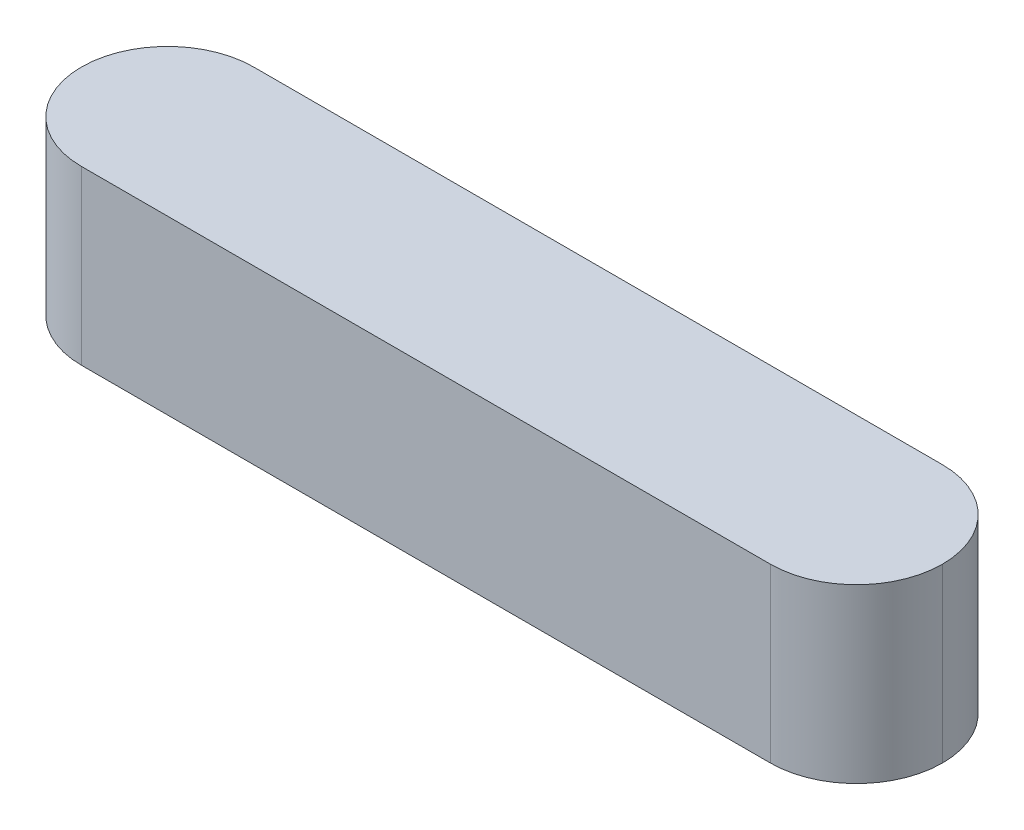
ISO-10303-21;
HEADER;
FILE_DESCRIPTION(('STEP AP214'),'2;1');
FILE_NAME('part.step','',(''),(''),'','','');
FILE_SCHEMA(('AUTOMOTIVE_DESIGN { 1 0 10303 214 1 1 1 1 }'));
ENDSEC;
DATA;
#1=APPLICATION_CONTEXT('core data for automotive mechanical design processes');
#2=APPLICATION_PROTOCOL_DEFINITION('international standard','automotive_design',2000,#1);
#3=PRODUCT_CONTEXT('',#1,'mechanical');
#4=PRODUCT('Part','Part','',(#3));
#5=PRODUCT_RELATED_PRODUCT_CATEGORY('part','',(#4));
#6=PRODUCT_DEFINITION_FORMATION('','',#4);
#7=PRODUCT_DEFINITION_CONTEXT('part definition',#1,'design');
#8=PRODUCT_DEFINITION('design','',#6,#7);
#9=PRODUCT_DEFINITION_SHAPE('','',#8);
#10=(LENGTH_UNIT() NAMED_UNIT(*) SI_UNIT(.MILLI.,.METRE.));
#11=(NAMED_UNIT(*) PLANE_ANGLE_UNIT() SI_UNIT($,.RADIAN.));
#12=(NAMED_UNIT(*) SI_UNIT($,.STERADIAN.) SOLID_ANGLE_UNIT());
#13=UNCERTAINTY_MEASURE_WITH_UNIT(LENGTH_MEASURE(1.E-05),#10,'distance_accuracy_value','');
#14=(GEOMETRIC_REPRESENTATION_CONTEXT(3) GLOBAL_UNCERTAINTY_ASSIGNED_CONTEXT((#13)) GLOBAL_UNIT_ASSIGNED_CONTEXT((#10,
#11,#12)) REPRESENTATION_CONTEXT('',''));
#15=CARTESIAN_POINT('',(0.,0.,0.));
#16=DIRECTION('',(0.,0.,1.));
#17=DIRECTION('',(1.,0.,0.));
#18=AXIS2_PLACEMENT_3D('',#15,#16,#17);
#19=CARTESIAN_POINT('',(0.,4.,0.));
#20=DIRECTION('',(0.,0.,-1.));
#21=DIRECTION('',(-1.,0.,0.));
#22=AXIS2_PLACEMENT_3D('',#19,#20,#21);
#23=PLANE('',#22);
#24=DIRECTION('',(1.,0.,0.));
#25=VECTOR('',#24,1.);
#26=CARTESIAN_POINT('',(0.,4.,0.));
#27=LINE('',#26,#25);
#28=CARTESIAN_POINT('',(2.,4.,0.));
#29=VERTEX_POINT('',#28);
#30=CARTESIAN_POINT('',(18.,4.,0.));
#31=VERTEX_POINT('',#30);
#32=EDGE_CURVE('E128',#29,#31,#27,.T.);
#33=ORIENTED_EDGE('',*,*,#32,.F.);
#34=DIRECTION('',(0.,-1.,0.));
#35=VECTOR('',#34,1.);
#36=CARTESIAN_POINT('',(2.,4.,0.));
#37=LINE('',#36,#35);
#38=CARTESIAN_POINT('',(2.,0.,0.));
#39=VERTEX_POINT('',#38);
#40=EDGE_CURVE('E11',#29,#39,#37,.T.);
#41=ORIENTED_EDGE('',*,*,#40,.T.);
#42=DIRECTION('',(1.,0.,0.));
#43=VECTOR('',#42,1.);
#44=CARTESIAN_POINT('',(0.,0.,0.));
#45=LINE('',#44,#43);
#46=CARTESIAN_POINT('',(18.,0.,0.));
#47=VERTEX_POINT('',#46);
#48=EDGE_CURVE('E91',#39,#47,#45,.T.);
#49=ORIENTED_EDGE('',*,*,#48,.T.);
#50=DIRECTION('',(0.,-1.,0.));
#51=VECTOR('',#50,1.);
#52=CARTESIAN_POINT('',(18.,4.,0.));
#53=LINE('',#52,#51);
#54=EDGE_CURVE('E39',#47,#31,#53,.F.);
#55=ORIENTED_EDGE('',*,*,#54,.T.);
#56=EDGE_LOOP('',(#33,#41,#49,#55));
#57=FACE_BOUND('',#56,.T.);
#58=ADVANCED_FACE('F32',(#57),#23,.F.);
#59=CARTESIAN_POINT('',(0.,4.,-4.));
#60=DIRECTION('',(0.,0.,1.));
#61=DIRECTION('',(1.,0.,0.));
#62=AXIS2_PLACEMENT_3D('',#59,#60,#61);
#63=PLANE('',#62);
#64=DIRECTION('',(-1.,0.,0.));
#65=VECTOR('',#64,1.);
#66=CARTESIAN_POINT('',(0.,0.,-4.));
#67=LINE('',#66,#65);
#68=CARTESIAN_POINT('',(18.,0.,-4.));
#69=VERTEX_POINT('',#68);
#70=CARTESIAN_POINT('',(2.,0.,-4.));
#71=VERTEX_POINT('',#70);
#72=EDGE_CURVE('E127',#69,#71,#67,.T.);
#73=ORIENTED_EDGE('',*,*,#72,.T.);
#74=DIRECTION('',(0.,-1.,0.));
#75=VECTOR('',#74,1.);
#76=CARTESIAN_POINT('',(2.,4.,-4.));
#77=LINE('',#76,#75);
#78=CARTESIAN_POINT('',(2.,4.,-4.));
#79=VERTEX_POINT('',#78);
#80=EDGE_CURVE('E107',#71,#79,#77,.F.);
#81=ORIENTED_EDGE('',*,*,#80,.T.);
#82=DIRECTION('',(-1.,0.,0.));
#83=VECTOR('',#82,1.);
#84=CARTESIAN_POINT('',(0.,4.,-4.));
#85=LINE('',#84,#83);
#86=CARTESIAN_POINT('',(18.,4.,-4.));
#87=VERTEX_POINT('',#86);
#88=EDGE_CURVE('E123',#87,#79,#85,.T.);
#89=ORIENTED_EDGE('',*,*,#88,.F.);
#90=DIRECTION('',(0.,-1.,0.));
#91=VECTOR('',#90,1.);
#92=CARTESIAN_POINT('',(18.,4.,-4.));
#93=LINE('',#92,#91);
#94=EDGE_CURVE('E108',#87,#69,#93,.T.);
#95=ORIENTED_EDGE('',*,*,#94,.T.);
#96=EDGE_LOOP('',(#73,#81,#89,#95));
#97=FACE_BOUND('',#96,.T.);
#98=ADVANCED_FACE('F125',(#97),#63,.F.);
#99=CARTESIAN_POINT('',(0.,4.,0.));
#100=DIRECTION('',(0.,-1.,0.));
#101=DIRECTION('',(0.,0.,-1.));
#102=AXIS2_PLACEMENT_3D('',#99,#100,#101);
#103=PLANE('',#102);
#104=ORIENTED_EDGE('',*,*,#88,.T.);
#105=CARTESIAN_POINT('',(2.,4.,-2.));
#106=DIRECTION('',(0.,-1.,0.));
#107=DIRECTION('',(0.,0.,-1.));
#108=AXIS2_PLACEMENT_3D('',#105,#106,#107);
#109=CIRCLE('',#108,2.);
#110=CARTESIAN_POINT('',(0.,4.,-2.));
#111=VERTEX_POINT('',#110);
#112=EDGE_CURVE('E119',#79,#111,#109,.F.);
#113=ORIENTED_EDGE('',*,*,#112,.T.);
#114=CARTESIAN_POINT('',(2.,4.,-2.));
#115=DIRECTION('',(0.,-1.,0.));
#116=DIRECTION('',(0.,0.,-1.));
#117=AXIS2_PLACEMENT_3D('',#114,#115,#116);
#118=CIRCLE('',#117,2.);
#119=EDGE_CURVE('E100',#111,#29,#118,.F.);
#120=ORIENTED_EDGE('',*,*,#119,.T.);
#121=ORIENTED_EDGE('',*,*,#32,.T.);
#122=CARTESIAN_POINT('',(18.,4.,-2.));
#123=DIRECTION('',(0.,-1.,0.));
#124=DIRECTION('',(0.,0.,-1.));
#125=AXIS2_PLACEMENT_3D('',#122,#123,#124);
#126=CIRCLE('',#125,2.);
#127=CARTESIAN_POINT('',(20.,4.,-2.));
#128=VERTEX_POINT('',#127);
#129=EDGE_CURVE('E46',#31,#128,#126,.F.);
#130=ORIENTED_EDGE('',*,*,#129,.T.);
#131=CARTESIAN_POINT('',(18.,4.,-2.));
#132=DIRECTION('',(0.,-1.,0.));
#133=DIRECTION('',(0.,0.,-1.));
#134=AXIS2_PLACEMENT_3D('',#131,#132,#133);
#135=CIRCLE('',#134,2.);
#136=EDGE_CURVE('E116',#128,#87,#135,.F.);
#137=ORIENTED_EDGE('',*,*,#136,.T.);
#138=EDGE_LOOP('',(#104,#113,#120,#121,#130,#137));
#139=FACE_BOUND('',#138,.T.);
#140=ADVANCED_FACE('F121',(#139),#103,.F.);
#141=CARTESIAN_POINT('',(0.,0.,0.));
#142=DIRECTION('',(0.,-1.,0.));
#143=DIRECTION('',(0.,0.,-1.));
#144=AXIS2_PLACEMENT_3D('',#141,#142,#143);
#145=PLANE('',#144);
#146=CARTESIAN_POINT('',(2.,0.,-2.));
#147=DIRECTION('',(0.,-1.,0.));
#148=DIRECTION('',(0.,0.,-1.));
#149=AXIS2_PLACEMENT_3D('',#146,#147,#148);
#150=CIRCLE('',#149,2.);
#151=CARTESIAN_POINT('',(0.,0.,-2.));
#152=VERTEX_POINT('',#151);
#153=EDGE_CURVE('E84',#39,#152,#150,.T.);
#154=ORIENTED_EDGE('',*,*,#153,.T.);
#155=CARTESIAN_POINT('',(2.,0.,-2.));
#156=DIRECTION('',(0.,-1.,0.));
#157=DIRECTION('',(0.,0.,-1.));
#158=AXIS2_PLACEMENT_3D('',#155,#156,#157);
#159=CIRCLE('',#158,2.);
#160=EDGE_CURVE('E89',#152,#71,#159,.T.);
#161=ORIENTED_EDGE('',*,*,#160,.T.);
#162=ORIENTED_EDGE('',*,*,#72,.F.);
#163=CARTESIAN_POINT('',(18.,0.,-2.));
#164=DIRECTION('',(0.,-1.,0.));
#165=DIRECTION('',(0.,0.,-1.));
#166=AXIS2_PLACEMENT_3D('',#163,#164,#165);
#167=CIRCLE('',#166,2.);
#168=CARTESIAN_POINT('',(20.,0.,-2.));
#169=VERTEX_POINT('',#168);
#170=EDGE_CURVE('E94',#69,#169,#167,.T.);
#171=ORIENTED_EDGE('',*,*,#170,.T.);
#172=CARTESIAN_POINT('',(18.,0.,-2.));
#173=DIRECTION('',(0.,-1.,0.));
#174=DIRECTION('',(0.,0.,-1.));
#175=AXIS2_PLACEMENT_3D('',#172,#173,#174);
#176=CIRCLE('',#175,2.);
#177=EDGE_CURVE('E134',#169,#47,#176,.T.);
#178=ORIENTED_EDGE('',*,*,#177,.T.);
#179=ORIENTED_EDGE('',*,*,#48,.F.);
#180=EDGE_LOOP('',(#154,#161,#162,#171,#178,#179));
#181=FACE_BOUND('',#180,.T.);
#182=ADVANCED_FACE('F86',(#181),#145,.T.);
#183=CARTESIAN_POINT('',(2.,4.,-2.));
#184=DIRECTION('',(0.,-1.,0.));
#185=DIRECTION('',(0.,0.,-1.));
#186=AXIS2_PLACEMENT_3D('',#183,#184,#185);
#187=CYLINDRICAL_SURFACE('',#186,2.);
#188=ORIENTED_EDGE('',*,*,#40,.F.);
#189=ORIENTED_EDGE('',*,*,#119,.F.);
#190=DIRECTION('',(0.,-1.,0.));
#191=VECTOR('',#190,1.);
#192=CARTESIAN_POINT('',(0.,4.,-2.));
#193=LINE('',#192,#191);
#194=EDGE_CURVE('E98',#152,#111,#193,.F.);
#195=ORIENTED_EDGE('',*,*,#194,.F.);
#196=ORIENTED_EDGE('',*,*,#153,.F.);
#197=EDGE_LOOP('',(#188,#189,#195,#196));
#198=FACE_BOUND('',#197,.T.);
#199=ADVANCED_FACE('F99',(#198),#187,.T.);
#200=CARTESIAN_POINT('',(2.,4.,-2.));
#201=DIRECTION('',(0.,-1.,0.));
#202=DIRECTION('',(0.,0.,-1.));
#203=AXIS2_PLACEMENT_3D('',#200,#201,#202);
#204=CYLINDRICAL_SURFACE('',#203,2.);
#205=ORIENTED_EDGE('',*,*,#112,.F.);
#206=ORIENTED_EDGE('',*,*,#80,.F.);
#207=ORIENTED_EDGE('',*,*,#160,.F.);
#208=ORIENTED_EDGE('',*,*,#194,.T.);
#209=EDGE_LOOP('',(#205,#206,#207,#208));
#210=FACE_BOUND('',#209,.T.);
#211=ADVANCED_FACE('F105',(#210),#204,.T.);
#212=CARTESIAN_POINT('',(18.,4.,-2.));
#213=DIRECTION('',(0.,-1.,0.));
#214=DIRECTION('',(0.,0.,-1.));
#215=AXIS2_PLACEMENT_3D('',#212,#213,#214);
#216=CYLINDRICAL_SURFACE('',#215,2.);
#217=DIRECTION('',(0.,-1.,0.));
#218=VECTOR('',#217,1.);
#219=CARTESIAN_POINT('',(20.,4.,-2.));
#220=LINE('',#219,#218);
#221=EDGE_CURVE('E102',#128,#169,#220,.T.);
#222=ORIENTED_EDGE('',*,*,#221,.F.);
#223=ORIENTED_EDGE('',*,*,#129,.F.);
#224=ORIENTED_EDGE('',*,*,#54,.F.);
#225=ORIENTED_EDGE('',*,*,#177,.F.);
#226=EDGE_LOOP('',(#222,#223,#224,#225));
#227=FACE_BOUND('',#226,.T.);
#228=ADVANCED_FACE('F139',(#227),#216,.T.);
#229=CARTESIAN_POINT('',(18.,4.,-2.));
#230=DIRECTION('',(0.,-1.,0.));
#231=DIRECTION('',(0.,0.,-1.));
#232=AXIS2_PLACEMENT_3D('',#229,#230,#231);
#233=CYLINDRICAL_SURFACE('',#232,2.);
#234=ORIENTED_EDGE('',*,*,#136,.F.);
#235=ORIENTED_EDGE('',*,*,#221,.T.);
#236=ORIENTED_EDGE('',*,*,#170,.F.);
#237=ORIENTED_EDGE('',*,*,#94,.F.);
#238=EDGE_LOOP('',(#234,#235,#236,#237));
#239=FACE_BOUND('',#238,.T.);
#240=ADVANCED_FACE('F141',(#239),#233,.T.);
#241=CLOSED_SHELL('',(#58,#98,#140,#182,#199,#211,#228,#240));
#242=MANIFOLD_SOLID_BREP('B2',#241);
#243=ADVANCED_BREP_SHAPE_REPRESENTATION('',(#18,#242),#14);
#244=SHAPE_DEFINITION_REPRESENTATION(#9,#243);
ENDSEC;
END-ISO-10303-21;
